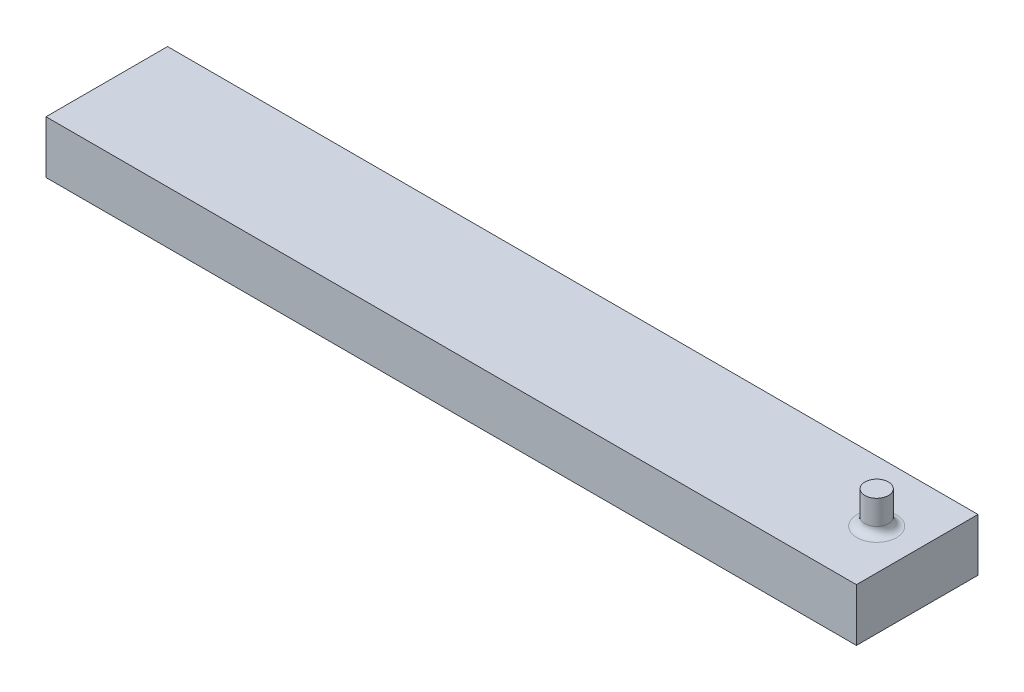
ISO-10303-21;
HEADER;
FILE_DESCRIPTION(('STEP AP214'),'2;1');
FILE_NAME('part.step','',(''),(''),'','','');
FILE_SCHEMA(('AUTOMOTIVE_DESIGN { 1 0 10303 214 1 1 1 1 }'));
ENDSEC;
DATA;
#1=APPLICATION_CONTEXT('core data for automotive mechanical design processes');
#2=APPLICATION_PROTOCOL_DEFINITION('international standard','automotive_design',2000,#1);
#3=PRODUCT_CONTEXT('',#1,'mechanical');
#4=PRODUCT('Part','Part','',(#3));
#5=PRODUCT_RELATED_PRODUCT_CATEGORY('part','',(#4));
#6=PRODUCT_DEFINITION_FORMATION('','',#4);
#7=PRODUCT_DEFINITION_CONTEXT('part definition',#1,'design');
#8=PRODUCT_DEFINITION('design','',#6,#7);
#9=PRODUCT_DEFINITION_SHAPE('','',#8);
#10=(LENGTH_UNIT() NAMED_UNIT(*) SI_UNIT(.MILLI.,.METRE.));
#11=(NAMED_UNIT(*) PLANE_ANGLE_UNIT() SI_UNIT($,.RADIAN.));
#12=(NAMED_UNIT(*) SI_UNIT($,.STERADIAN.) SOLID_ANGLE_UNIT());
#13=UNCERTAINTY_MEASURE_WITH_UNIT(LENGTH_MEASURE(1.E-05),#10,'distance_accuracy_value','');
#14=(GEOMETRIC_REPRESENTATION_CONTEXT(3) GLOBAL_UNCERTAINTY_ASSIGNED_CONTEXT((#13)) GLOBAL_UNIT_ASSIGNED_CONTEXT((#10,
#11,#12)) REPRESENTATION_CONTEXT('',''));
#15=CARTESIAN_POINT('',(0.,0.,0.));
#16=DIRECTION('',(0.,0.,1.));
#17=DIRECTION('',(1.,0.,0.));
#18=AXIS2_PLACEMENT_3D('',#15,#16,#17);
#19=CARTESIAN_POINT('',(0.,-3.25,0.));
#20=DIRECTION('',(0.,-1.,0.));
#21=DIRECTION('',(0.,0.,-1.));
#22=AXIS2_PLACEMENT_3D('',#19,#20,#21);
#23=PLANE('',#22);
#24=CARTESIAN_POINT('',(-40.,-3.25,0.));
#25=DIRECTION('',(0.,-1.,0.));
#26=DIRECTION('',(0.,0.,-1.));
#27=AXIS2_PLACEMENT_3D('',#24,#25,#26);
#28=CIRCLE('',#27,5.1);
#29=CARTESIAN_POINT('',(-40.,-3.25,-5.1));
#30=VERTEX_POINT('',#29);
#31=EDGE_CURVE('E158',#30,#30,#28,.T.);
#32=ORIENTED_EDGE('',*,*,#31,.F.);
#33=EDGE_LOOP('',(#32));
#34=FACE_BOUND('',#33,.T.);
#35=DIRECTION('',(0.,0.,-1.));
#36=VECTOR('',#35,1.);
#37=CARTESIAN_POINT('',(50.,-3.25,7.5));
#38=LINE('',#37,#36);
#39=CARTESIAN_POINT('',(50.,-3.25,7.5));
#40=VERTEX_POINT('',#39);
#41=CARTESIAN_POINT('',(50.,-3.25,-7.5));
#42=VERTEX_POINT('',#41);
#43=EDGE_CURVE('E164',#40,#42,#38,.T.);
#44=ORIENTED_EDGE('',*,*,#43,.F.);
#45=DIRECTION('',(1.,0.,0.));
#46=VECTOR('',#45,1.);
#47=CARTESIAN_POINT('',(-50.,-3.25,7.5));
#48=LINE('',#47,#46);
#49=CARTESIAN_POINT('',(-50.,-3.25,7.5));
#50=VERTEX_POINT('',#49);
#51=EDGE_CURVE('E81',#50,#40,#48,.T.);
#52=ORIENTED_EDGE('',*,*,#51,.F.);
#53=DIRECTION('',(0.,0.,1.));
#54=VECTOR('',#53,1.);
#55=CARTESIAN_POINT('',(-50.,-3.25,7.5));
#56=LINE('',#55,#54);
#57=CARTESIAN_POINT('',(-50.,-3.25,-7.5));
#58=VERTEX_POINT('',#57);
#59=EDGE_CURVE('E176',#58,#50,#56,.T.);
#60=ORIENTED_EDGE('',*,*,#59,.F.);
#61=DIRECTION('',(-1.,0.,0.));
#62=VECTOR('',#61,1.);
#63=CARTESIAN_POINT('',(-50.,-3.25,-7.5));
#64=LINE('',#63,#62);
#65=EDGE_CURVE('E174',#42,#58,#64,.T.);
#66=ORIENTED_EDGE('',*,*,#65,.F.);
#67=EDGE_LOOP('',(#44,#52,#60,#66));
#68=FACE_BOUND('',#67,.T.);
#69=DIRECTION('',(0.,0.,1.));
#70=VECTOR('',#69,1.);
#71=CARTESIAN_POINT('',(-15.,-3.25,-1.125));
#72=LINE('',#71,#70);
#73=CARTESIAN_POINT('',(-15.,-3.25,-1.125));
#74=VERTEX_POINT('',#73);
#75=CARTESIAN_POINT('',(-15.,-3.25,1.125));
#76=VERTEX_POINT('',#75);
#77=EDGE_CURVE('E128',#74,#76,#72,.T.);
#78=ORIENTED_EDGE('',*,*,#77,.F.);
#79=DIRECTION('',(1.,0.,0.));
#80=VECTOR('',#79,1.);
#81=CARTESIAN_POINT('',(0.,-3.25,-1.125));
#82=LINE('',#81,#80);
#83=CARTESIAN_POINT('',(-23.5,-3.25,-1.125));
#84=VERTEX_POINT('',#83);
#85=EDGE_CURVE('E135',#84,#74,#82,.T.);
#86=ORIENTED_EDGE('',*,*,#85,.F.);
#87=DIRECTION('',(0.,0.,1.));
#88=VECTOR('',#87,1.);
#89=CARTESIAN_POINT('',(-23.5,-3.25,-1.125));
#90=LINE('',#89,#88);
#91=CARTESIAN_POINT('',(-23.5,-3.25,1.125));
#92=VERTEX_POINT('',#91);
#93=EDGE_CURVE('E161',#84,#92,#90,.T.);
#94=ORIENTED_EDGE('',*,*,#93,.T.);
#95=DIRECTION('',(1.,0.,0.));
#96=VECTOR('',#95,1.);
#97=CARTESIAN_POINT('',(0.,-3.25,1.125));
#98=LINE('',#97,#96);
#99=EDGE_CURVE('E146',#92,#76,#98,.T.);
#100=ORIENTED_EDGE('',*,*,#99,.T.);
#101=EDGE_LOOP('',(#78,#86,#94,#100));
#102=FACE_BOUND('',#101,.T.);
#103=ADVANCED_FACE('F36',(#34,#68,#102),#23,.T.);
#104=CARTESIAN_POINT('',(50.,3.25,7.5));
#105=DIRECTION('',(-1.,0.,0.));
#106=DIRECTION('',(0.,0.,1.));
#107=AXIS2_PLACEMENT_3D('',#104,#105,#106);
#108=PLANE('',#107);
#109=ORIENTED_EDGE('',*,*,#43,.T.);
#110=DIRECTION('',(0.,-1.,0.));
#111=VECTOR('',#110,1.);
#112=CARTESIAN_POINT('',(50.,3.25,-7.5));
#113=LINE('',#112,#111);
#114=CARTESIAN_POINT('',(50.,3.25,-7.5));
#115=VERTEX_POINT('',#114);
#116=EDGE_CURVE('E185',#115,#42,#113,.T.);
#117=ORIENTED_EDGE('',*,*,#116,.F.);
#118=DIRECTION('',(0.,0.,-1.));
#119=VECTOR('',#118,1.);
#120=CARTESIAN_POINT('',(50.,3.25,7.5));
#121=LINE('',#120,#119);
#122=CARTESIAN_POINT('',(50.,3.25,7.5));
#123=VERTEX_POINT('',#122);
#124=EDGE_CURVE('E165',#123,#115,#121,.T.);
#125=ORIENTED_EDGE('',*,*,#124,.F.);
#126=DIRECTION('',(0.,-1.,0.));
#127=VECTOR('',#126,1.);
#128=CARTESIAN_POINT('',(50.,3.25,7.5));
#129=LINE('',#128,#127);
#130=EDGE_CURVE('E171',#123,#40,#129,.T.);
#131=ORIENTED_EDGE('',*,*,#130,.T.);
#132=EDGE_LOOP('',(#109,#117,#125,#131));
#133=FACE_BOUND('',#132,.T.);
#134=ADVANCED_FACE('F208',(#133),#108,.F.);
#135=CARTESIAN_POINT('',(-50.,3.25,-7.5));
#136=DIRECTION('',(0.,0.,1.));
#137=DIRECTION('',(1.,0.,0.));
#138=AXIS2_PLACEMENT_3D('',#135,#136,#137);
#139=PLANE('',#138);
#140=ORIENTED_EDGE('',*,*,#65,.T.);
#141=DIRECTION('',(0.,-1.,0.));
#142=VECTOR('',#141,1.);
#143=CARTESIAN_POINT('',(-50.,3.25,-7.5));
#144=LINE('',#143,#142);
#145=CARTESIAN_POINT('',(-50.,3.25,-7.5));
#146=VERTEX_POINT('',#145);
#147=EDGE_CURVE('E182',#146,#58,#144,.T.);
#148=ORIENTED_EDGE('',*,*,#147,.F.);
#149=DIRECTION('',(-1.,0.,0.));
#150=VECTOR('',#149,1.);
#151=CARTESIAN_POINT('',(-50.,3.25,-7.5));
#152=LINE('',#151,#150);
#153=EDGE_CURVE('E89',#115,#146,#152,.T.);
#154=ORIENTED_EDGE('',*,*,#153,.F.);
#155=ORIENTED_EDGE('',*,*,#116,.T.);
#156=EDGE_LOOP('',(#140,#148,#154,#155));
#157=FACE_BOUND('',#156,.T.);
#158=ADVANCED_FACE('F214',(#157),#139,.F.);
#159=CARTESIAN_POINT('',(-50.,3.25,7.5));
#160=DIRECTION('',(1.,0.,0.));
#161=DIRECTION('',(0.,0.,-1.));
#162=AXIS2_PLACEMENT_3D('',#159,#160,#161);
#163=PLANE('',#162);
#164=ORIENTED_EDGE('',*,*,#59,.T.);
#165=DIRECTION('',(0.,-1.,0.));
#166=VECTOR('',#165,1.);
#167=CARTESIAN_POINT('',(-50.,3.25,7.5));
#168=LINE('',#167,#166);
#169=CARTESIAN_POINT('',(-50.,3.25,7.5));
#170=VERTEX_POINT('',#169);
#171=EDGE_CURVE('E180',#170,#50,#168,.T.);
#172=ORIENTED_EDGE('',*,*,#171,.F.);
#173=DIRECTION('',(0.,0.,1.));
#174=VECTOR('',#173,1.);
#175=CARTESIAN_POINT('',(-50.,3.25,7.5));
#176=LINE('',#175,#174);
#177=EDGE_CURVE('E168',#146,#170,#176,.T.);
#178=ORIENTED_EDGE('',*,*,#177,.F.);
#179=ORIENTED_EDGE('',*,*,#147,.T.);
#180=EDGE_LOOP('',(#164,#172,#178,#179));
#181=FACE_BOUND('',#180,.T.);
#182=ADVANCED_FACE('F225',(#181),#163,.F.);
#183=CARTESIAN_POINT('',(-50.,3.25,7.5));
#184=DIRECTION('',(0.,0.,-1.));
#185=DIRECTION('',(-1.,0.,0.));
#186=AXIS2_PLACEMENT_3D('',#183,#184,#185);
#187=PLANE('',#186);
#188=ORIENTED_EDGE('',*,*,#51,.T.);
#189=ORIENTED_EDGE('',*,*,#130,.F.);
#190=DIRECTION('',(1.,0.,0.));
#191=VECTOR('',#190,1.);
#192=CARTESIAN_POINT('',(-50.,3.25,7.5));
#193=LINE('',#192,#191);
#194=EDGE_CURVE('E60',#170,#123,#193,.T.);
#195=ORIENTED_EDGE('',*,*,#194,.F.);
#196=ORIENTED_EDGE('',*,*,#171,.T.);
#197=EDGE_LOOP('',(#188,#189,#195,#196));
#198=FACE_BOUND('',#197,.T.);
#199=ADVANCED_FACE('F222',(#198),#187,.F.);
#200=CARTESIAN_POINT('',(0.,3.25,0.));
#201=DIRECTION('',(0.,-1.,0.));
#202=DIRECTION('',(0.,0.,-1.));
#203=AXIS2_PLACEMENT_3D('',#200,#201,#202);
#204=PLANE('',#203);
#205=CARTESIAN_POINT('',(45.,3.25,0.));
#206=DIRECTION('',(0.,-1.,0.));
#207=DIRECTION('',(0.,0.,-1.));
#208=AXIS2_PLACEMENT_3D('',#205,#206,#207);
#209=CIRCLE('',#208,2.45);
#210=CARTESIAN_POINT('',(45.,3.25,-2.45));
#211=VERTEX_POINT('',#210);
#212=EDGE_CURVE('E11',#211,#211,#209,.T.);
#213=ORIENTED_EDGE('',*,*,#212,.T.);
#214=EDGE_LOOP('',(#213));
#215=FACE_BOUND('',#214,.T.);
#216=ORIENTED_EDGE('',*,*,#124,.T.);
#217=ORIENTED_EDGE('',*,*,#153,.T.);
#218=ORIENTED_EDGE('',*,*,#177,.T.);
#219=ORIENTED_EDGE('',*,*,#194,.T.);
#220=EDGE_LOOP('',(#216,#217,#218,#219));
#221=FACE_BOUND('',#220,.T.);
#222=ADVANCED_FACE('F220',(#215,#221),#204,.F.);
#223=CARTESIAN_POINT('',(45.,7.25,0.));
#224=DIRECTION('',(0.,-1.,0.));
#225=DIRECTION('',(0.,0.,-1.));
#226=AXIS2_PLACEMENT_3D('',#223,#224,#225);
#227=CYLINDRICAL_SURFACE('',#226,1.45);
#228=CARTESIAN_POINT('',(45.,4.25,0.));
#229=DIRECTION('',(0.,-1.,0.));
#230=DIRECTION('',(0.,0.,-1.));
#231=AXIS2_PLACEMENT_3D('',#228,#229,#230);
#232=CIRCLE('',#231,1.45);
#233=CARTESIAN_POINT('',(45.,4.25,-1.45));
#234=VERTEX_POINT('',#233);
#235=EDGE_CURVE('E44',#234,#234,#232,.F.);
#236=ORIENTED_EDGE('',*,*,#235,.T.);
#237=EDGE_LOOP('',(#236));
#238=FACE_BOUND('',#237,.T.);
#239=CARTESIAN_POINT('',(45.,7.25,0.));
#240=DIRECTION('',(0.,1.,0.));
#241=DIRECTION('',(0.,0.,1.));
#242=AXIS2_PLACEMENT_3D('',#239,#240,#241);
#243=CIRCLE('',#242,1.45);
#244=CARTESIAN_POINT('',(45.,7.25,1.45));
#245=VERTEX_POINT('',#244);
#246=EDGE_CURVE('E157',#245,#245,#243,.T.);
#247=ORIENTED_EDGE('',*,*,#246,.F.);
#248=EDGE_LOOP('',(#247));
#249=FACE_BOUND('',#248,.T.);
#250=ADVANCED_FACE('F189',(#238,#249),#227,.T.);
#251=CARTESIAN_POINT('',(45.,7.25,0.));
#252=DIRECTION('',(0.,1.,0.));
#253=DIRECTION('',(0.,0.,1.));
#254=AXIS2_PLACEMENT_3D('',#251,#252,#253);
#255=PLANE('',#254);
#256=ORIENTED_EDGE('',*,*,#246,.T.);
#257=EDGE_LOOP('',(#256));
#258=FACE_BOUND('',#257,.T.);
#259=ADVANCED_FACE('F243',(#258),#255,.T.);
#260=CARTESIAN_POINT('',(-40.,0.75,0.));
#261=DIRECTION('',(0.,-1.,0.));
#262=DIRECTION('',(0.,0.,-1.));
#263=AXIS2_PLACEMENT_3D('',#260,#261,#262);
#264=CYLINDRICAL_SURFACE('',#263,5.1);
#265=CARTESIAN_POINT('',(-40.,0.75,0.));
#266=DIRECTION('',(0.,-1.,0.));
#267=DIRECTION('',(0.,0.,-1.));
#268=AXIS2_PLACEMENT_3D('',#265,#266,#267);
#269=CIRCLE('',#268,5.1);
#270=CARTESIAN_POINT('',(-40.,0.75,-5.1));
#271=VERTEX_POINT('',#270);
#272=EDGE_CURVE('E154',#271,#271,#269,.T.);
#273=ORIENTED_EDGE('',*,*,#272,.F.);
#274=EDGE_LOOP('',(#273));
#275=FACE_BOUND('',#274,.T.);
#276=ORIENTED_EDGE('',*,*,#31,.T.);
#277=EDGE_LOOP('',(#276));
#278=FACE_BOUND('',#277,.T.);
#279=ADVANCED_FACE('F203',(#275,#278),#264,.F.);
#280=CARTESIAN_POINT('',(-40.,0.75,0.));
#281=DIRECTION('',(0.,-1.,0.));
#282=DIRECTION('',(0.,0.,-1.));
#283=AXIS2_PLACEMENT_3D('',#280,#281,#282);
#284=PLANE('',#283);
#285=ORIENTED_EDGE('',*,*,#272,.T.);
#286=EDGE_LOOP('',(#285));
#287=FACE_BOUND('',#286,.T.);
#288=ADVANCED_FACE('F194',(#287),#284,.T.);
#289=CARTESIAN_POINT('',(45.,4.25,0.));
#290=DIRECTION('',(0.,-1.,0.));
#291=DIRECTION('',(0.,0.,-1.));
#292=AXIS2_PLACEMENT_3D('',#289,#290,#291);
#293=TOROIDAL_SURFACE('',#292,2.45,1.);
#294=ORIENTED_EDGE('',*,*,#212,.F.);
#295=EDGE_LOOP('',(#294));
#296=FACE_BOUND('',#295,.T.);
#297=ORIENTED_EDGE('',*,*,#235,.F.);
#298=EDGE_LOOP('',(#297));
#299=FACE_BOUND('',#298,.T.);
#300=ADVANCED_FACE('F38',(#296,#299),#293,.F.);
#301=CARTESIAN_POINT('',(-23.5,0.,-1.125));
#302=DIRECTION('',(1.,0.,0.));
#303=DIRECTION('',(0.,0.,-1.));
#304=AXIS2_PLACEMENT_3D('',#301,#302,#303);
#305=PLANE('',#304);
#306=DIRECTION('',(0.,1.,0.));
#307=VECTOR('',#306,1.);
#308=CARTESIAN_POINT('',(-23.5,0.,1.125));
#309=LINE('',#308,#307);
#310=CARTESIAN_POINT('',(-23.5,0.75,1.125));
#311=VERTEX_POINT('',#310);
#312=EDGE_CURVE('E144',#92,#311,#309,.T.);
#313=ORIENTED_EDGE('',*,*,#312,.F.);
#314=ORIENTED_EDGE('',*,*,#93,.F.);
#315=DIRECTION('',(0.,1.,0.));
#316=VECTOR('',#315,1.);
#317=CARTESIAN_POINT('',(-23.5,0.,-1.125));
#318=LINE('',#317,#316);
#319=CARTESIAN_POINT('',(-23.5,0.75,-1.125));
#320=VERTEX_POINT('',#319);
#321=EDGE_CURVE('E141',#84,#320,#318,.T.);
#322=ORIENTED_EDGE('',*,*,#321,.T.);
#323=DIRECTION('',(0.,0.,1.));
#324=VECTOR('',#323,1.);
#325=CARTESIAN_POINT('',(-23.5,0.75,-1.125));
#326=LINE('',#325,#324);
#327=EDGE_CURVE('E379',#320,#311,#326,.T.);
#328=ORIENTED_EDGE('',*,*,#327,.T.);
#329=EDGE_LOOP('',(#313,#314,#322,#328));
#330=FACE_BOUND('',#329,.T.);
#331=ADVANCED_FACE('F193',(#330),#305,.T.);
#332=CARTESIAN_POINT('',(0.,0.75,-1.125));
#333=DIRECTION('',(0.,-1.,0.));
#334=DIRECTION('',(0.,0.,-1.));
#335=AXIS2_PLACEMENT_3D('',#332,#333,#334);
#336=PLANE('',#335);
#337=DIRECTION('',(1.,0.,0.));
#338=VECTOR('',#337,1.);
#339=CARTESIAN_POINT('',(0.,0.75,1.125));
#340=LINE('',#339,#338);
#341=CARTESIAN_POINT('',(-10.,0.75,1.125));
#342=VERTEX_POINT('',#341);
#343=EDGE_CURVE('E397',#311,#342,#340,.T.);
#344=ORIENTED_EDGE('',*,*,#343,.F.);
#345=ORIENTED_EDGE('',*,*,#327,.F.);
#346=DIRECTION('',(1.,0.,0.));
#347=VECTOR('',#346,1.);
#348=CARTESIAN_POINT('',(0.,0.75,-1.125));
#349=LINE('',#348,#347);
#350=CARTESIAN_POINT('',(-10.,0.75,-1.125));
#351=VERTEX_POINT('',#350);
#352=EDGE_CURVE('E150',#320,#351,#349,.T.);
#353=ORIENTED_EDGE('',*,*,#352,.T.);
#354=DIRECTION('',(0.,0.,1.));
#355=VECTOR('',#354,1.);
#356=CARTESIAN_POINT('',(-10.,0.75,-1.125));
#357=LINE('',#356,#355);
#358=EDGE_CURVE('E381',#351,#342,#357,.T.);
#359=ORIENTED_EDGE('',*,*,#358,.T.);
#360=EDGE_LOOP('',(#344,#345,#353,#359));
#361=FACE_BOUND('',#360,.T.);
#362=ADVANCED_FACE('F200',(#361),#336,.T.);
#363=CARTESIAN_POINT('',(-10.,0.,-1.125));
#364=DIRECTION('',(-1.,0.,0.));
#365=DIRECTION('',(0.,0.,1.));
#366=AXIS2_PLACEMENT_3D('',#363,#364,#365);
#367=PLANE('',#366);
#368=DIRECTION('',(0.,-1.,0.));
#369=VECTOR('',#368,1.);
#370=CARTESIAN_POINT('',(-10.,0.,1.125));
#371=LINE('',#370,#369);
#372=CARTESIAN_POINT('',(-10.,-2.5,1.125));
#373=VERTEX_POINT('',#372);
#374=EDGE_CURVE('E391',#342,#373,#371,.T.);
#375=ORIENTED_EDGE('',*,*,#374,.F.);
#376=ORIENTED_EDGE('',*,*,#358,.F.);
#377=DIRECTION('',(0.,-1.,0.));
#378=VECTOR('',#377,1.);
#379=CARTESIAN_POINT('',(-10.,0.,-1.125));
#380=LINE('',#379,#378);
#381=CARTESIAN_POINT('',(-10.,-2.5,-1.125));
#382=VERTEX_POINT('',#381);
#383=EDGE_CURVE('E393',#351,#382,#380,.T.);
#384=ORIENTED_EDGE('',*,*,#383,.T.);
#385=DIRECTION('',(0.,0.,1.));
#386=VECTOR('',#385,1.);
#387=CARTESIAN_POINT('',(-10.,-2.5,-1.125));
#388=LINE('',#387,#386);
#389=EDGE_CURVE('E148',#382,#373,#388,.T.);
#390=ORIENTED_EDGE('',*,*,#389,.T.);
#391=EDGE_LOOP('',(#375,#376,#384,#390));
#392=FACE_BOUND('',#391,.T.);
#393=ADVANCED_FACE('F258',(#392),#367,.T.);
#394=CARTESIAN_POINT('',(0.,-2.5,-1.125));
#395=DIRECTION('',(0.,-1.,0.));
#396=DIRECTION('',(0.,0.,-1.));
#397=AXIS2_PLACEMENT_3D('',#394,#395,#396);
#398=PLANE('',#397);
#399=DIRECTION('',(1.,0.,0.));
#400=VECTOR('',#399,1.);
#401=CARTESIAN_POINT('',(0.,-2.5,1.125));
#402=LINE('',#401,#400);
#403=CARTESIAN_POINT('',(-15.,-2.5,1.125));
#404=VERTEX_POINT('',#403);
#405=EDGE_CURVE('E395',#404,#373,#402,.T.);
#406=ORIENTED_EDGE('',*,*,#405,.T.);
#407=ORIENTED_EDGE('',*,*,#389,.F.);
#408=DIRECTION('',(1.,0.,0.));
#409=VECTOR('',#408,1.);
#410=CARTESIAN_POINT('',(0.,-2.5,-1.125));
#411=LINE('',#410,#409);
#412=CARTESIAN_POINT('',(-15.,-2.5,-1.125));
#413=VERTEX_POINT('',#412);
#414=EDGE_CURVE('E134',#413,#382,#411,.T.);
#415=ORIENTED_EDGE('',*,*,#414,.F.);
#416=DIRECTION('',(0.,0.,1.));
#417=VECTOR('',#416,1.);
#418=CARTESIAN_POINT('',(-15.,-2.5,-1.125));
#419=LINE('',#418,#417);
#420=EDGE_CURVE('E130',#413,#404,#419,.T.);
#421=ORIENTED_EDGE('',*,*,#420,.T.);
#422=EDGE_LOOP('',(#406,#407,#415,#421));
#423=FACE_BOUND('',#422,.T.);
#424=ADVANCED_FACE('F255',(#423),#398,.F.);
#425=CARTESIAN_POINT('',(-15.,0.,-1.125));
#426=DIRECTION('',(1.,0.,0.));
#427=DIRECTION('',(0.,0.,-1.));
#428=AXIS2_PLACEMENT_3D('',#425,#426,#427);
#429=PLANE('',#428);
#430=DIRECTION('',(0.,1.,0.));
#431=VECTOR('',#430,1.);
#432=CARTESIAN_POINT('',(-15.,0.,1.125));
#433=LINE('',#432,#431);
#434=EDGE_CURVE('E51',#76,#404,#433,.T.);
#435=ORIENTED_EDGE('',*,*,#434,.T.);
#436=ORIENTED_EDGE('',*,*,#420,.F.);
#437=DIRECTION('',(0.,1.,0.));
#438=VECTOR('',#437,1.);
#439=CARTESIAN_POINT('',(-15.,0.,-1.125));
#440=LINE('',#439,#438);
#441=EDGE_CURVE('E124',#74,#413,#440,.T.);
#442=ORIENTED_EDGE('',*,*,#441,.F.);
#443=ORIENTED_EDGE('',*,*,#77,.T.);
#444=EDGE_LOOP('',(#435,#436,#442,#443));
#445=FACE_BOUND('',#444,.T.);
#446=ADVANCED_FACE('F126',(#445),#429,.F.);
#447=CARTESIAN_POINT('',(0.,0.,-1.125));
#448=DIRECTION('',(0.,0.,1.));
#449=DIRECTION('',(1.,0.,0.));
#450=AXIS2_PLACEMENT_3D('',#447,#448,#449);
#451=PLANE('',#450);
#452=ORIENTED_EDGE('',*,*,#85,.T.);
#453=ORIENTED_EDGE('',*,*,#441,.T.);
#454=ORIENTED_EDGE('',*,*,#414,.T.);
#455=ORIENTED_EDGE('',*,*,#383,.F.);
#456=ORIENTED_EDGE('',*,*,#352,.F.);
#457=ORIENTED_EDGE('',*,*,#321,.F.);
#458=EDGE_LOOP('',(#452,#453,#454,#455,#456,#457));
#459=FACE_BOUND('',#458,.T.);
#460=ADVANCED_FACE('F139',(#459),#451,.T.);
#461=CARTESIAN_POINT('',(0.,0.,1.125));
#462=DIRECTION('',(0.,0.,1.));
#463=DIRECTION('',(1.,0.,0.));
#464=AXIS2_PLACEMENT_3D('',#461,#462,#463);
#465=PLANE('',#464);
#466=ORIENTED_EDGE('',*,*,#99,.F.);
#467=ORIENTED_EDGE('',*,*,#312,.T.);
#468=ORIENTED_EDGE('',*,*,#343,.T.);
#469=ORIENTED_EDGE('',*,*,#374,.T.);
#470=ORIENTED_EDGE('',*,*,#405,.F.);
#471=ORIENTED_EDGE('',*,*,#434,.F.);
#472=EDGE_LOOP('',(#466,#467,#468,#469,#470,#471));
#473=FACE_BOUND('',#472,.T.);
#474=ADVANCED_FACE('F266',(#473),#465,.F.);
#475=CLOSED_SHELL('',(#103,#134,#158,#182,#199,#222,#250,#259,#279,#288,#300,#331,#362,#393,
#424,#446,#460,#474));
#476=MANIFOLD_SOLID_BREP('B2',#475);
#477=ADVANCED_BREP_SHAPE_REPRESENTATION('',(#18,#476),#14);
#478=SHAPE_DEFINITION_REPRESENTATION(#9,#477);
ENDSEC;
END-ISO-10303-21;
